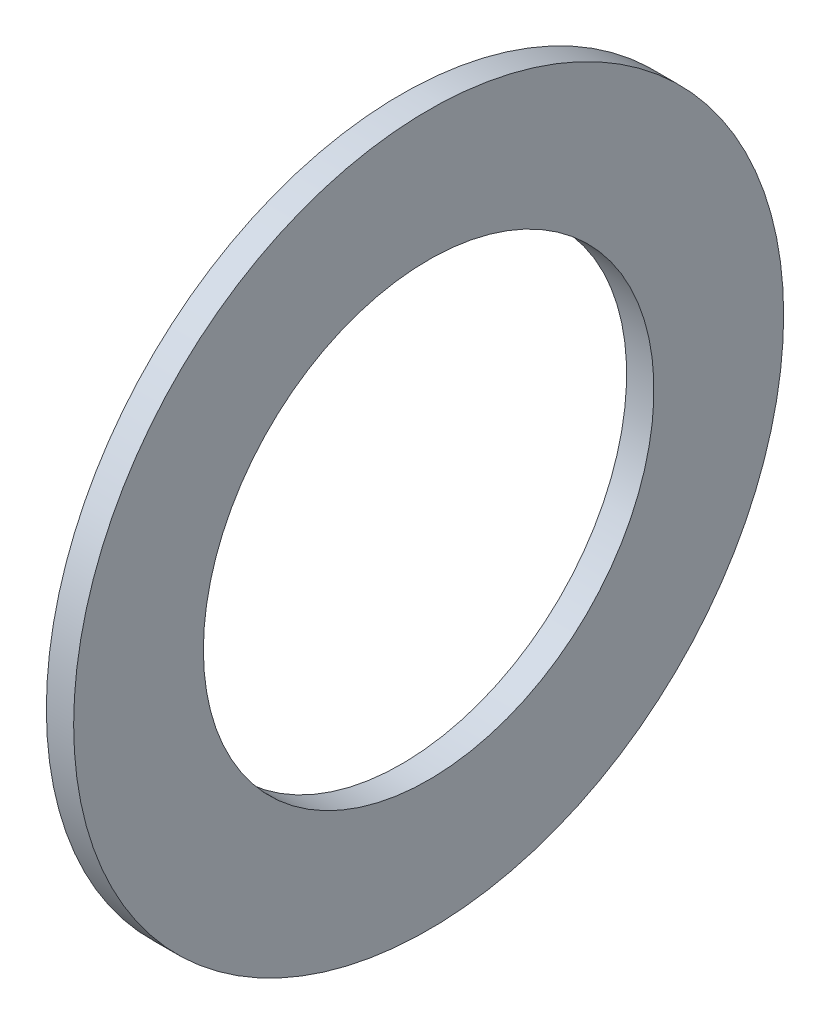
ISO-10303-21;
HEADER;
FILE_DESCRIPTION(('STEP AP214'),'2;1');
FILE_NAME('part.step','',(''),(''),'','','');
FILE_SCHEMA(('AUTOMOTIVE_DESIGN { 1 0 10303 214 1 1 1 1 }'));
ENDSEC;
DATA;
#1=APPLICATION_CONTEXT('core data for automotive mechanical design processes');
#2=APPLICATION_PROTOCOL_DEFINITION('international standard','automotive_design',2000,#1);
#3=PRODUCT_CONTEXT('',#1,'mechanical');
#4=PRODUCT('Part','Part','',(#3));
#5=PRODUCT_RELATED_PRODUCT_CATEGORY('part','',(#4));
#6=PRODUCT_DEFINITION_FORMATION('','',#4);
#7=PRODUCT_DEFINITION_CONTEXT('part definition',#1,'design');
#8=PRODUCT_DEFINITION('design','',#6,#7);
#9=PRODUCT_DEFINITION_SHAPE('','',#8);
#10=(LENGTH_UNIT() NAMED_UNIT(*) SI_UNIT(.MILLI.,.METRE.));
#11=(NAMED_UNIT(*) PLANE_ANGLE_UNIT() SI_UNIT($,.RADIAN.));
#12=(NAMED_UNIT(*) SI_UNIT($,.STERADIAN.) SOLID_ANGLE_UNIT());
#13=UNCERTAINTY_MEASURE_WITH_UNIT(LENGTH_MEASURE(1.E-05),#10,'distance_accuracy_value','');
#14=(GEOMETRIC_REPRESENTATION_CONTEXT(3) GLOBAL_UNCERTAINTY_ASSIGNED_CONTEXT((#13)) GLOBAL_UNIT_ASSIGNED_CONTEXT((#10,
#11,#12)) REPRESENTATION_CONTEXT('',''));
#15=CARTESIAN_POINT('',(0.,0.,0.));
#16=DIRECTION('',(0.,0.,1.));
#17=DIRECTION('',(1.,0.,0.));
#18=AXIS2_PLACEMENT_3D('',#15,#16,#17);
#19=CARTESIAN_POINT('',(-34.9249999999999,0.,0.));
#20=DIRECTION('',(-1.,0.,0.));
#21=DIRECTION('',(0.,0.,1.));
#22=AXIS2_PLACEMENT_3D('',#19,#20,#21);
#23=CYLINDRICAL_SURFACE('',#22,8.25);
#24=CARTESIAN_POINT('',(0.,0.,0.));
#25=DIRECTION('',(-1.,0.,0.));
#26=DIRECTION('',(0.,0.,1.));
#27=AXIS2_PLACEMENT_3D('',#24,#25,#26);
#28=CIRCLE('',#27,8.25);
#29=CARTESIAN_POINT('',(0.,0.,8.25));
#30=VERTEX_POINT('',#29);
#31=EDGE_CURVE('E12',#30,#30,#28,.T.);
#32=ORIENTED_EDGE('',*,*,#31,.F.);
#33=EDGE_LOOP('',(#32));
#34=FACE_BOUND('',#33,.T.);
#35=CARTESIAN_POINT('',(-1.,0.,0.));
#36=DIRECTION('',(-1.,0.,0.));
#37=DIRECTION('',(0.,0.,1.));
#38=AXIS2_PLACEMENT_3D('',#35,#36,#37);
#39=CIRCLE('',#38,8.25);
#40=CARTESIAN_POINT('',(-1.,0.,8.25));
#41=VERTEX_POINT('',#40);
#42=EDGE_CURVE('E54',#41,#41,#39,.T.);
#43=ORIENTED_EDGE('',*,*,#42,.T.);
#44=EDGE_LOOP('',(#43));
#45=FACE_BOUND('',#44,.T.);
#46=ADVANCED_FACE('F40',(#34,#45),#23,.F.);
#47=CARTESIAN_POINT('',(0.,8.25,0.));
#48=DIRECTION('',(-1.,0.,0.));
#49=DIRECTION('',(0.,0.,1.));
#50=AXIS2_PLACEMENT_3D('',#47,#48,#49);
#51=PLANE('',#50);
#52=CARTESIAN_POINT('',(0.,0.,0.));
#53=DIRECTION('',(-1.,0.,0.));
#54=DIRECTION('',(0.,0.,1.));
#55=AXIS2_PLACEMENT_3D('',#52,#53,#54);
#56=CIRCLE('',#55,13.);
#57=CARTESIAN_POINT('',(0.,0.,13.));
#58=VERTEX_POINT('',#57);
#59=EDGE_CURVE('E46',#58,#58,#56,.T.);
#60=ORIENTED_EDGE('',*,*,#59,.F.);
#61=EDGE_LOOP('',(#60));
#62=FACE_BOUND('',#61,.T.);
#63=ORIENTED_EDGE('',*,*,#31,.T.);
#64=EDGE_LOOP('',(#63));
#65=FACE_BOUND('',#64,.T.);
#66=ADVANCED_FACE('F69',(#62,#65),#51,.F.);
#67=CARTESIAN_POINT('',(-34.9249999999999,0.,0.));
#68=DIRECTION('',(-1.,0.,0.));
#69=DIRECTION('',(0.,0.,1.));
#70=AXIS2_PLACEMENT_3D('',#67,#68,#69);
#71=CYLINDRICAL_SURFACE('',#70,13.);
#72=CARTESIAN_POINT('',(-1.,0.,0.));
#73=DIRECTION('',(-1.,0.,0.));
#74=DIRECTION('',(0.,0.,1.));
#75=AXIS2_PLACEMENT_3D('',#72,#73,#74);
#76=CIRCLE('',#75,13.);
#77=CARTESIAN_POINT('',(-1.,0.,13.));
#78=VERTEX_POINT('',#77);
#79=EDGE_CURVE('E50',#78,#78,#76,.T.);
#80=ORIENTED_EDGE('',*,*,#79,.F.);
#81=EDGE_LOOP('',(#80));
#82=FACE_BOUND('',#81,.T.);
#83=ORIENTED_EDGE('',*,*,#59,.T.);
#84=EDGE_LOOP('',(#83));
#85=FACE_BOUND('',#84,.T.);
#86=ADVANCED_FACE('F64',(#82,#85),#71,.T.);
#87=CARTESIAN_POINT('',(-1.,13.,0.));
#88=DIRECTION('',(1.,0.,0.));
#89=DIRECTION('',(0.,0.,-1.));
#90=AXIS2_PLACEMENT_3D('',#87,#88,#89);
#91=PLANE('',#90);
#92=ORIENTED_EDGE('',*,*,#42,.F.);
#93=EDGE_LOOP('',(#92));
#94=FACE_BOUND('',#93,.T.);
#95=ORIENTED_EDGE('',*,*,#79,.T.);
#96=EDGE_LOOP('',(#95));
#97=FACE_BOUND('',#96,.T.);
#98=ADVANCED_FACE('F61',(#94,#97),#91,.F.);
#99=CLOSED_SHELL('',(#46,#66,#86,#98));
#100=MANIFOLD_SOLID_BREP('B2',#99);
#101=ADVANCED_BREP_SHAPE_REPRESENTATION('',(#18,#100),#14);
#102=SHAPE_DEFINITION_REPRESENTATION(#9,#101);
ENDSEC;
END-ISO-10303-21;
